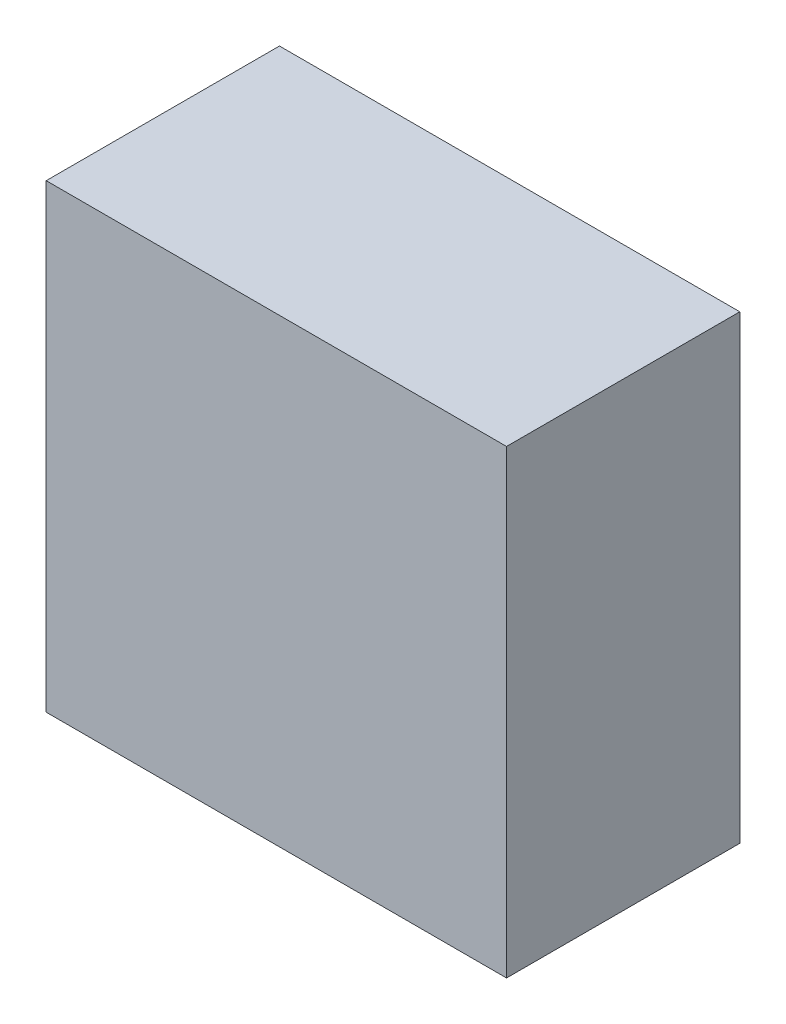
ISO-10303-21;
HEADER;
FILE_DESCRIPTION(('STEP AP214'),'2;1');
FILE_NAME('part.step','',(''),(''),'','','');
FILE_SCHEMA(('AUTOMOTIVE_DESIGN { 1 0 10303 214 1 1 1 1 }'));
ENDSEC;
DATA;
#1=APPLICATION_CONTEXT('core data for automotive mechanical design processes');
#2=APPLICATION_PROTOCOL_DEFINITION('international standard','automotive_design',2000,#1);
#3=PRODUCT_CONTEXT('',#1,'mechanical');
#4=PRODUCT('Part','Part','',(#3));
#5=PRODUCT_RELATED_PRODUCT_CATEGORY('part','',(#4));
#6=PRODUCT_DEFINITION_FORMATION('','',#4);
#7=PRODUCT_DEFINITION_CONTEXT('part definition',#1,'design');
#8=PRODUCT_DEFINITION('design','',#6,#7);
#9=PRODUCT_DEFINITION_SHAPE('','',#8);
#10=(LENGTH_UNIT() NAMED_UNIT(*) SI_UNIT(.MILLI.,.METRE.));
#11=(NAMED_UNIT(*) PLANE_ANGLE_UNIT() SI_UNIT($,.RADIAN.));
#12=(NAMED_UNIT(*) SI_UNIT($,.STERADIAN.) SOLID_ANGLE_UNIT());
#13=UNCERTAINTY_MEASURE_WITH_UNIT(LENGTH_MEASURE(1.E-05),#10,'distance_accuracy_value','');
#14=(GEOMETRIC_REPRESENTATION_CONTEXT(3) GLOBAL_UNCERTAINTY_ASSIGNED_CONTEXT((#13)) GLOBAL_UNIT_ASSIGNED_CONTEXT((#10,
#11,#12)) REPRESENTATION_CONTEXT('',''));
#15=CARTESIAN_POINT('',(0.,0.,0.));
#16=DIRECTION('',(0.,0.,1.));
#17=DIRECTION('',(1.,0.,0.));
#18=AXIS2_PLACEMENT_3D('',#15,#16,#17);
#19=CARTESIAN_POINT('',(0.,0.,0.));
#20=DIRECTION('',(0.,0.,1.));
#21=DIRECTION('',(1.,0.,0.));
#22=AXIS2_PLACEMENT_3D('',#19,#20,#21);
#23=PLANE('',#22);
#24=DIRECTION('',(-1.,0.,0.));
#25=VECTOR('',#24,1.);
#26=CARTESIAN_POINT('',(1.27,-1.27,0.));
#27=LINE('',#26,#25);
#28=CARTESIAN_POINT('',(1.27,-1.27,0.));
#29=VERTEX_POINT('',#28);
#30=CARTESIAN_POINT('',(-1.27,-1.27,0.));
#31=VERTEX_POINT('',#30);
#32=EDGE_CURVE('E26',#29,#31,#27,.T.);
#33=ORIENTED_EDGE('',*,*,#32,.T.);
#34=DIRECTION('',(0.,1.,0.));
#35=VECTOR('',#34,1.);
#36=CARTESIAN_POINT('',(-1.27,-1.27,0.));
#37=LINE('',#36,#35);
#38=CARTESIAN_POINT('',(-1.27,1.27,0.));
#39=VERTEX_POINT('',#38);
#40=EDGE_CURVE('E19',#31,#39,#37,.T.);
#41=ORIENTED_EDGE('',*,*,#40,.T.);
#42=DIRECTION('',(1.,0.,0.));
#43=VECTOR('',#42,1.);
#44=CARTESIAN_POINT('',(-1.27,1.27,0.));
#45=LINE('',#44,#43);
#46=CARTESIAN_POINT('',(1.27,1.27,0.));
#47=VERTEX_POINT('',#46);
#48=EDGE_CURVE('E65',#39,#47,#45,.T.);
#49=ORIENTED_EDGE('',*,*,#48,.T.);
#50=DIRECTION('',(0.,-1.,0.));
#51=VECTOR('',#50,1.);
#52=CARTESIAN_POINT('',(1.27,1.27,0.));
#53=LINE('',#52,#51);
#54=EDGE_CURVE('E82',#47,#29,#53,.T.);
#55=ORIENTED_EDGE('',*,*,#54,.T.);
#56=EDGE_LOOP('',(#33,#41,#49,#55));
#57=FACE_BOUND('',#56,.T.);
#58=ADVANCED_FACE('F15',(#57),#23,.F.);
#59=CARTESIAN_POINT('',(0.,0.,1.287));
#60=DIRECTION('',(0.,0.,1.));
#61=DIRECTION('',(1.,0.,0.));
#62=AXIS2_PLACEMENT_3D('',#59,#60,#61);
#63=PLANE('',#62);
#64=DIRECTION('',(1.,0.,0.));
#65=VECTOR('',#64,1.);
#66=CARTESIAN_POINT('',(1.27,-1.27,1.287));
#67=LINE('',#66,#65);
#68=CARTESIAN_POINT('',(-1.27,-1.27,1.287));
#69=VERTEX_POINT('',#68);
#70=CARTESIAN_POINT('',(1.27,-1.27,1.287));
#71=VERTEX_POINT('',#70);
#72=EDGE_CURVE('E10',#69,#71,#67,.T.);
#73=ORIENTED_EDGE('',*,*,#72,.T.);
#74=DIRECTION('',(0.,1.,0.));
#75=VECTOR('',#74,1.);
#76=CARTESIAN_POINT('',(1.27,1.27,1.287));
#77=LINE('',#76,#75);
#78=CARTESIAN_POINT('',(1.27,1.27,1.287));
#79=VERTEX_POINT('',#78);
#80=EDGE_CURVE('E73',#71,#79,#77,.T.);
#81=ORIENTED_EDGE('',*,*,#80,.T.);
#82=DIRECTION('',(-1.,0.,0.));
#83=VECTOR('',#82,1.);
#84=CARTESIAN_POINT('',(-1.27,1.27,1.287));
#85=LINE('',#84,#83);
#86=CARTESIAN_POINT('',(-1.27,1.27,1.287));
#87=VERTEX_POINT('',#86);
#88=EDGE_CURVE('E77',#79,#87,#85,.T.);
#89=ORIENTED_EDGE('',*,*,#88,.T.);
#90=DIRECTION('',(0.,-1.,0.));
#91=VECTOR('',#90,1.);
#92=CARTESIAN_POINT('',(-1.27,-1.27,1.287));
#93=LINE('',#92,#91);
#94=EDGE_CURVE('E102',#87,#69,#93,.T.);
#95=ORIENTED_EDGE('',*,*,#94,.T.);
#96=EDGE_LOOP('',(#73,#81,#89,#95));
#97=FACE_BOUND('',#96,.T.);
#98=ADVANCED_FACE('F75',(#97),#63,.T.);
#99=CARTESIAN_POINT('',(-1.27,-1.27,0.));
#100=DIRECTION('',(0.,-1.,0.));
#101=DIRECTION('',(-1.,0.,0.));
#102=AXIS2_PLACEMENT_3D('',#99,#100,#101);
#103=PLANE('',#102);
#104=ORIENTED_EDGE('',*,*,#32,.F.);
#105=DIRECTION('',(0.,0.,1.));
#106=VECTOR('',#105,1.);
#107=CARTESIAN_POINT('',(1.27,-1.27,0.));
#108=LINE('',#107,#106);
#109=EDGE_CURVE('E81',#29,#71,#108,.T.);
#110=ORIENTED_EDGE('',*,*,#109,.T.);
#111=ORIENTED_EDGE('',*,*,#72,.F.);
#112=DIRECTION('',(0.,0.,1.));
#113=VECTOR('',#112,1.);
#114=CARTESIAN_POINT('',(-1.27,-1.27,0.));
#115=LINE('',#114,#113);
#116=EDGE_CURVE('E105',#31,#69,#115,.T.);
#117=ORIENTED_EDGE('',*,*,#116,.F.);
#118=EDGE_LOOP('',(#104,#110,#111,#117));
#119=FACE_BOUND('',#118,.T.);
#120=ADVANCED_FACE('F124',(#119),#103,.T.);
#121=CARTESIAN_POINT('',(1.27,-1.27,0.));
#122=DIRECTION('',(1.,0.,0.));
#123=DIRECTION('',(0.,-1.,0.));
#124=AXIS2_PLACEMENT_3D('',#121,#122,#123);
#125=PLANE('',#124);
#126=ORIENTED_EDGE('',*,*,#54,.F.);
#127=DIRECTION('',(0.,0.,1.));
#128=VECTOR('',#127,1.);
#129=CARTESIAN_POINT('',(1.27,1.27,0.));
#130=LINE('',#129,#128);
#131=EDGE_CURVE('E83',#47,#79,#130,.T.);
#132=ORIENTED_EDGE('',*,*,#131,.T.);
#133=ORIENTED_EDGE('',*,*,#80,.F.);
#134=ORIENTED_EDGE('',*,*,#109,.F.);
#135=EDGE_LOOP('',(#126,#132,#133,#134));
#136=FACE_BOUND('',#135,.T.);
#137=ADVANCED_FACE('F84',(#136),#125,.T.);
#138=CARTESIAN_POINT('',(1.27,1.27,0.));
#139=DIRECTION('',(0.,1.,0.));
#140=DIRECTION('',(0.,0.,-1.));
#141=AXIS2_PLACEMENT_3D('',#138,#139,#140);
#142=PLANE('',#141);
#143=ORIENTED_EDGE('',*,*,#48,.F.);
#144=DIRECTION('',(0.,0.,1.));
#145=VECTOR('',#144,1.);
#146=CARTESIAN_POINT('',(-1.27,1.27,0.));
#147=LINE('',#146,#145);
#148=EDGE_CURVE('E89',#39,#87,#147,.T.);
#149=ORIENTED_EDGE('',*,*,#148,.T.);
#150=ORIENTED_EDGE('',*,*,#88,.F.);
#151=ORIENTED_EDGE('',*,*,#131,.F.);
#152=EDGE_LOOP('',(#143,#149,#150,#151));
#153=FACE_BOUND('',#152,.T.);
#154=ADVANCED_FACE('F88',(#153),#142,.T.);
#155=CARTESIAN_POINT('',(-1.27,1.27,0.));
#156=DIRECTION('',(-1.,0.,0.));
#157=DIRECTION('',(0.,0.,1.));
#158=AXIS2_PLACEMENT_3D('',#155,#156,#157);
#159=PLANE('',#158);
#160=ORIENTED_EDGE('',*,*,#40,.F.);
#161=ORIENTED_EDGE('',*,*,#116,.T.);
#162=ORIENTED_EDGE('',*,*,#94,.F.);
#163=ORIENTED_EDGE('',*,*,#148,.F.);
#164=EDGE_LOOP('',(#160,#161,#162,#163));
#165=FACE_BOUND('',#164,.T.);
#166=ADVANCED_FACE('F17',(#165),#159,.T.);
#167=CLOSED_SHELL('',(#58,#98,#120,#137,#154,#166));
#168=MANIFOLD_SOLID_BREP('B1',#167);
#169=ADVANCED_BREP_SHAPE_REPRESENTATION('',(#18,#168),#14);
#170=SHAPE_DEFINITION_REPRESENTATION(#9,#169);
ENDSEC;
END-ISO-10303-21;
